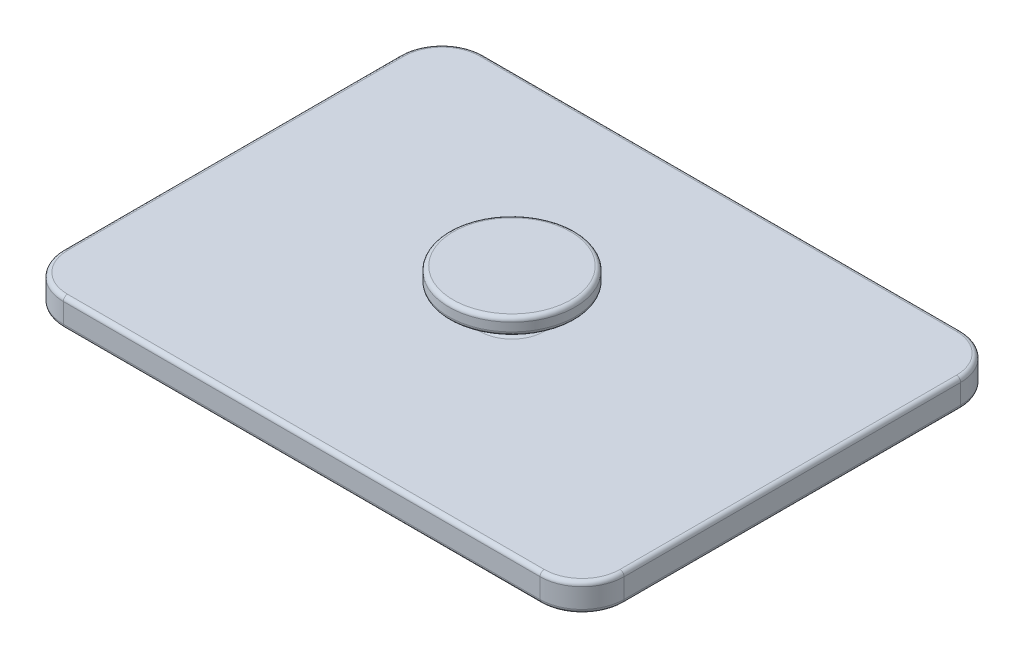
ISO-10303-21;
HEADER;
FILE_DESCRIPTION(('STEP AP214'),'2;1');
FILE_NAME('part.step','',(''),(''),'','','');
FILE_SCHEMA(('AUTOMOTIVE_DESIGN { 1 0 10303 214 1 1 1 1 }'));
ENDSEC;
DATA;
#1=APPLICATION_CONTEXT('core data for automotive mechanical design processes');
#2=APPLICATION_PROTOCOL_DEFINITION('international standard','automotive_design',2000,#1);
#3=PRODUCT_CONTEXT('',#1,'mechanical');
#4=PRODUCT('Part','Part','',(#3));
#5=PRODUCT_RELATED_PRODUCT_CATEGORY('part','',(#4));
#6=PRODUCT_DEFINITION_FORMATION('','',#4);
#7=PRODUCT_DEFINITION_CONTEXT('part definition',#1,'design');
#8=PRODUCT_DEFINITION('design','',#6,#7);
#9=PRODUCT_DEFINITION_SHAPE('','',#8);
#10=(LENGTH_UNIT() NAMED_UNIT(*) SI_UNIT(.MILLI.,.METRE.));
#11=(NAMED_UNIT(*) PLANE_ANGLE_UNIT() SI_UNIT($,.RADIAN.));
#12=(NAMED_UNIT(*) SI_UNIT($,.STERADIAN.) SOLID_ANGLE_UNIT());
#13=UNCERTAINTY_MEASURE_WITH_UNIT(LENGTH_MEASURE(1.E-05),#10,'distance_accuracy_value','');
#14=(GEOMETRIC_REPRESENTATION_CONTEXT(3) GLOBAL_UNCERTAINTY_ASSIGNED_CONTEXT((#13)) GLOBAL_UNIT_ASSIGNED_CONTEXT((#10,
#11,#12)) REPRESENTATION_CONTEXT('',''));
#15=CARTESIAN_POINT('',(0.,0.,0.));
#16=DIRECTION('',(0.,0.,1.));
#17=DIRECTION('',(1.,0.,0.));
#18=AXIS2_PLACEMENT_3D('',#15,#16,#17);
#19=CARTESIAN_POINT('',(0.,-21.2,0.));
#20=DIRECTION('',(0.,1.,0.));
#21=DIRECTION('',(0.,0.,1.));
#22=AXIS2_PLACEMENT_3D('',#19,#20,#21);
#23=CYLINDRICAL_SURFACE('',#22,4.5);
#24=CARTESIAN_POINT('',(0.,-20.3,0.));
#25=DIRECTION('',(0.,-1.,0.));
#26=DIRECTION('',(0.,0.,-1.));
#27=AXIS2_PLACEMENT_3D('',#24,#25,#26);
#28=CIRCLE('',#27,4.5);
#29=CARTESIAN_POINT('',(0.,-20.3,-4.5));
#30=VERTEX_POINT('',#29);
#31=EDGE_CURVE('E277',#30,#30,#28,.T.);
#32=ORIENTED_EDGE('',*,*,#31,.T.);
#33=EDGE_LOOP('',(#32));
#34=FACE_BOUND('',#33,.T.);
#35=CARTESIAN_POINT('',(0.,-20.9,0.));
#36=DIRECTION('',(0.,-1.,0.));
#37=DIRECTION('',(0.,0.,-1.));
#38=AXIS2_PLACEMENT_3D('',#35,#36,#37);
#39=CIRCLE('',#38,4.5);
#40=CARTESIAN_POINT('',(0.,-20.9,-4.5));
#41=VERTEX_POINT('',#40);
#42=EDGE_CURVE('E274',#41,#41,#39,.F.);
#43=ORIENTED_EDGE('',*,*,#42,.T.);
#44=EDGE_LOOP('',(#43));
#45=FACE_BOUND('',#44,.T.);
#46=ADVANCED_FACE('F34',(#34,#45),#23,.T.);
#47=CARTESIAN_POINT('',(0.,-21.2,0.));
#48=DIRECTION('',(0.,-1.,0.));
#49=DIRECTION('',(0.,0.,-1.));
#50=AXIS2_PLACEMENT_3D('',#47,#48,#49);
#51=PLANE('',#50);
#52=CARTESIAN_POINT('',(0.,-21.2,0.));
#53=DIRECTION('',(0.,-1.,0.));
#54=DIRECTION('',(0.,0.,-1.));
#55=AXIS2_PLACEMENT_3D('',#52,#53,#54);
#56=CIRCLE('',#55,2.3);
#57=CARTESIAN_POINT('',(0.,-21.2,-2.3));
#58=VERTEX_POINT('',#57);
#59=EDGE_CURVE('E11',#58,#58,#56,.F.);
#60=ORIENTED_EDGE('',*,*,#59,.T.);
#61=EDGE_LOOP('',(#60));
#62=FACE_BOUND('',#61,.T.);
#63=CARTESIAN_POINT('',(0.,-21.2,0.));
#64=DIRECTION('',(0.,-1.,0.));
#65=DIRECTION('',(0.,0.,-1.));
#66=AXIS2_PLACEMENT_3D('',#63,#64,#65);
#67=CIRCLE('',#66,4.2);
#68=CARTESIAN_POINT('',(0.,-21.2,-4.2));
#69=VERTEX_POINT('',#68);
#70=EDGE_CURVE('E250',#69,#69,#67,.T.);
#71=ORIENTED_EDGE('',*,*,#70,.T.);
#72=EDGE_LOOP('',(#71));
#73=FACE_BOUND('',#72,.T.);
#74=ADVANCED_FACE('F304',(#62,#73),#51,.T.);
#75=CARTESIAN_POINT('',(0.,-20.,0.));
#76=DIRECTION('',(0.,-1.,0.));
#77=DIRECTION('',(0.,0.,-1.));
#78=AXIS2_PLACEMENT_3D('',#75,#76,#77);
#79=PLANE('',#78);
#80=CARTESIAN_POINT('',(0.,-20.,0.));
#81=DIRECTION('',(0.,-1.,0.));
#82=DIRECTION('',(0.,0.,-1.));
#83=AXIS2_PLACEMENT_3D('',#80,#81,#82);
#84=CIRCLE('',#83,4.2);
#85=CARTESIAN_POINT('',(0.,-20.,-4.2));
#86=VERTEX_POINT('',#85);
#87=EDGE_CURVE('E280',#86,#86,#84,.F.);
#88=ORIENTED_EDGE('',*,*,#87,.T.);
#89=EDGE_LOOP('',(#88));
#90=FACE_BOUND('',#89,.T.);
#91=ADVANCED_FACE('F310',(#90),#79,.F.);
#92=CARTESIAN_POINT('',(0.,-22.9,0.));
#93=DIRECTION('',(0.,1.,0.));
#94=DIRECTION('',(0.,0.,1.));
#95=AXIS2_PLACEMENT_3D('',#92,#93,#94);
#96=CYLINDRICAL_SURFACE('',#95,2.);
#97=CARTESIAN_POINT('',(0.,-21.5,0.));
#98=DIRECTION('',(0.,-1.,0.));
#99=DIRECTION('',(0.,0.,-1.));
#100=AXIS2_PLACEMENT_3D('',#97,#98,#99);
#101=CIRCLE('',#100,2.);
#102=CARTESIAN_POINT('',(0.,-21.5,-2.));
#103=VERTEX_POINT('',#102);
#104=EDGE_CURVE('E42',#103,#103,#101,.T.);
#105=ORIENTED_EDGE('',*,*,#104,.T.);
#106=EDGE_LOOP('',(#105));
#107=FACE_BOUND('',#106,.T.);
#108=CARTESIAN_POINT('',(0.,-22.6,0.));
#109=DIRECTION('',(0.,-1.,0.));
#110=DIRECTION('',(0.,0.,-1.));
#111=AXIS2_PLACEMENT_3D('',#108,#109,#110);
#112=CIRCLE('',#111,2.);
#113=CARTESIAN_POINT('',(0.,-22.6,-2.));
#114=VERTEX_POINT('',#113);
#115=EDGE_CURVE('E286',#114,#114,#112,.F.);
#116=ORIENTED_EDGE('',*,*,#115,.T.);
#117=EDGE_LOOP('',(#116));
#118=FACE_BOUND('',#117,.T.);
#119=ADVANCED_FACE('F291',(#107,#118),#96,.T.);
#120=CARTESIAN_POINT('',(-20.,-24.9,-15.));
#121=DIRECTION('',(1.,0.,0.));
#122=DIRECTION('',(0.,0.,-1.));
#123=AXIS2_PLACEMENT_3D('',#120,#121,#122);
#124=PLANE('',#123);
#125=DIRECTION('',(0.,1.,0.));
#126=VECTOR('',#125,1.);
#127=CARTESIAN_POINT('',(-20.,-24.9,12.));
#128=LINE('',#127,#126);
#129=CARTESIAN_POINT('',(-20.,-24.6,12.));
#130=VERTEX_POINT('',#129);
#131=CARTESIAN_POINT('',(-20.,-23.2,12.));
#132=VERTEX_POINT('',#131);
#133=EDGE_CURVE('E171',#130,#132,#128,.T.);
#134=ORIENTED_EDGE('',*,*,#133,.T.);
#135=DIRECTION('',(0.,0.,-1.));
#136=VECTOR('',#135,1.);
#137=CARTESIAN_POINT('',(-20.,-23.2,-15.));
#138=LINE('',#137,#136);
#139=CARTESIAN_POINT('',(-20.,-23.2,-12.));
#140=VERTEX_POINT('',#139);
#141=EDGE_CURVE('E238',#132,#140,#138,.T.);
#142=ORIENTED_EDGE('',*,*,#141,.T.);
#143=DIRECTION('',(0.,1.,0.));
#144=VECTOR('',#143,1.);
#145=CARTESIAN_POINT('',(-20.,-24.9,-12.));
#146=LINE('',#145,#144);
#147=CARTESIAN_POINT('',(-20.,-24.6,-12.));
#148=VERTEX_POINT('',#147);
#149=EDGE_CURVE('E666',#140,#148,#146,.F.);
#150=ORIENTED_EDGE('',*,*,#149,.T.);
#151=DIRECTION('',(0.,0.,-1.));
#152=VECTOR('',#151,1.);
#153=CARTESIAN_POINT('',(-20.,-24.6,12.));
#154=LINE('',#153,#152);
#155=EDGE_CURVE('E178',#148,#130,#154,.F.);
#156=ORIENTED_EDGE('',*,*,#155,.T.);
#157=EDGE_LOOP('',(#134,#142,#150,#156));
#158=FACE_BOUND('',#157,.T.);
#159=ADVANCED_FACE('F408',(#158),#124,.F.);
#160=CARTESIAN_POINT('',(20.,-24.9,-15.));
#161=DIRECTION('',(0.,0.,1.));
#162=DIRECTION('',(1.,0.,0.));
#163=AXIS2_PLACEMENT_3D('',#160,#161,#162);
#164=PLANE('',#163);
#165=DIRECTION('',(0.,1.,0.));
#166=VECTOR('',#165,1.);
#167=CARTESIAN_POINT('',(-17.,-24.9,-15.));
#168=LINE('',#167,#166);
#169=CARTESIAN_POINT('',(-17.,-24.6,-15.));
#170=VERTEX_POINT('',#169);
#171=CARTESIAN_POINT('',(-17.,-23.2,-15.));
#172=VERTEX_POINT('',#171);
#173=EDGE_CURVE('E656',#170,#172,#168,.T.);
#174=ORIENTED_EDGE('',*,*,#173,.T.);
#175=DIRECTION('',(1.,0.,0.));
#176=VECTOR('',#175,1.);
#177=CARTESIAN_POINT('',(20.,-23.2,-15.));
#178=LINE('',#177,#176);
#179=CARTESIAN_POINT('',(17.,-23.2,-15.));
#180=VERTEX_POINT('',#179);
#181=EDGE_CURVE('E49',#172,#180,#178,.T.);
#182=ORIENTED_EDGE('',*,*,#181,.T.);
#183=DIRECTION('',(0.,1.,0.));
#184=VECTOR('',#183,1.);
#185=CARTESIAN_POINT('',(17.,-24.9,-15.));
#186=LINE('',#185,#184);
#187=CARTESIAN_POINT('',(17.,-24.6,-15.));
#188=VERTEX_POINT('',#187);
#189=EDGE_CURVE('E660',#180,#188,#186,.F.);
#190=ORIENTED_EDGE('',*,*,#189,.T.);
#191=DIRECTION('',(1.,0.,0.));
#192=VECTOR('',#191,1.);
#193=CARTESIAN_POINT('',(-17.,-24.6,-15.));
#194=LINE('',#193,#192);
#195=EDGE_CURVE('E198',#188,#170,#194,.F.);
#196=ORIENTED_EDGE('',*,*,#195,.T.);
#197=EDGE_LOOP('',(#174,#182,#190,#196));
#198=FACE_BOUND('',#197,.T.);
#199=ADVANCED_FACE('F413',(#198),#164,.F.);
#200=CARTESIAN_POINT('',(20.,-24.9,-15.));
#201=DIRECTION('',(-1.,0.,0.));
#202=DIRECTION('',(0.,0.,1.));
#203=AXIS2_PLACEMENT_3D('',#200,#201,#202);
#204=PLANE('',#203);
#205=DIRECTION('',(0.,1.,0.));
#206=VECTOR('',#205,1.);
#207=CARTESIAN_POINT('',(20.,-24.9,-12.));
#208=LINE('',#207,#206);
#209=CARTESIAN_POINT('',(20.,-24.6,-12.));
#210=VERTEX_POINT('',#209);
#211=CARTESIAN_POINT('',(20.,-23.2,-12.));
#212=VERTEX_POINT('',#211);
#213=EDGE_CURVE('E650',#210,#212,#208,.T.);
#214=ORIENTED_EDGE('',*,*,#213,.T.);
#215=DIRECTION('',(0.,0.,1.));
#216=VECTOR('',#215,1.);
#217=CARTESIAN_POINT('',(20.,-23.2,-15.));
#218=LINE('',#217,#216);
#219=CARTESIAN_POINT('',(20.,-23.2,12.));
#220=VERTEX_POINT('',#219);
#221=EDGE_CURVE('E246',#212,#220,#218,.T.);
#222=ORIENTED_EDGE('',*,*,#221,.T.);
#223=DIRECTION('',(0.,1.,0.));
#224=VECTOR('',#223,1.);
#225=CARTESIAN_POINT('',(20.,-24.9,12.));
#226=LINE('',#225,#224);
#227=CARTESIAN_POINT('',(20.,-24.6,12.));
#228=VERTEX_POINT('',#227);
#229=EDGE_CURVE('E218',#220,#228,#226,.F.);
#230=ORIENTED_EDGE('',*,*,#229,.T.);
#231=DIRECTION('',(0.,0.,1.));
#232=VECTOR('',#231,1.);
#233=CARTESIAN_POINT('',(20.,-24.6,-12.));
#234=LINE('',#233,#232);
#235=EDGE_CURVE('E193',#228,#210,#234,.F.);
#236=ORIENTED_EDGE('',*,*,#235,.T.);
#237=EDGE_LOOP('',(#214,#222,#230,#236));
#238=FACE_BOUND('',#237,.T.);
#239=ADVANCED_FACE('F419',(#238),#204,.F.);
#240=CARTESIAN_POINT('',(20.,-24.9,15.));
#241=DIRECTION('',(0.,0.,-1.));
#242=DIRECTION('',(-1.,0.,0.));
#243=AXIS2_PLACEMENT_3D('',#240,#241,#242);
#244=PLANE('',#243);
#245=DIRECTION('',(0.,1.,0.));
#246=VECTOR('',#245,1.);
#247=CARTESIAN_POINT('',(17.,-24.9,15.));
#248=LINE('',#247,#246);
#249=CARTESIAN_POINT('',(17.,-24.6,15.));
#250=VERTEX_POINT('',#249);
#251=CARTESIAN_POINT('',(17.,-23.2,15.));
#252=VERTEX_POINT('',#251);
#253=EDGE_CURVE('E664',#250,#252,#248,.T.);
#254=ORIENTED_EDGE('',*,*,#253,.T.);
#255=DIRECTION('',(-1.,0.,0.));
#256=VECTOR('',#255,1.);
#257=CARTESIAN_POINT('',(20.,-23.2,15.));
#258=LINE('',#257,#256);
#259=CARTESIAN_POINT('',(-17.,-23.2,15.));
#260=VERTEX_POINT('',#259);
#261=EDGE_CURVE('E242',#252,#260,#258,.T.);
#262=ORIENTED_EDGE('',*,*,#261,.T.);
#263=DIRECTION('',(0.,1.,0.));
#264=VECTOR('',#263,1.);
#265=CARTESIAN_POINT('',(-17.,-24.9,15.));
#266=LINE('',#265,#264);
#267=CARTESIAN_POINT('',(-17.,-24.6,15.));
#268=VERTEX_POINT('',#267);
#269=EDGE_CURVE('E662',#260,#268,#266,.F.);
#270=ORIENTED_EDGE('',*,*,#269,.T.);
#271=DIRECTION('',(-1.,0.,0.));
#272=VECTOR('',#271,1.);
#273=CARTESIAN_POINT('',(17.,-24.6,15.));
#274=LINE('',#273,#272);
#275=EDGE_CURVE('E188',#268,#250,#274,.F.);
#276=ORIENTED_EDGE('',*,*,#275,.T.);
#277=EDGE_LOOP('',(#254,#262,#270,#276));
#278=FACE_BOUND('',#277,.T.);
#279=ADVANCED_FACE('F422',(#278),#244,.F.);
#280=CARTESIAN_POINT('',(0.,-24.9,0.));
#281=DIRECTION('',(0.,-1.,0.));
#282=DIRECTION('',(0.,0.,-1.));
#283=AXIS2_PLACEMENT_3D('',#280,#281,#282);
#284=PLANE('',#283);
#285=DIRECTION('',(0.,0.,-1.));
#286=VECTOR('',#285,1.);
#287=CARTESIAN_POINT('',(-19.7,-24.9,-12.));
#288=LINE('',#287,#286);
#289=CARTESIAN_POINT('',(-19.7,-24.9,12.));
#290=VERTEX_POINT('',#289);
#291=CARTESIAN_POINT('',(-19.7,-24.9,-12.));
#292=VERTEX_POINT('',#291);
#293=EDGE_CURVE('E175',#290,#292,#288,.T.);
#294=ORIENTED_EDGE('',*,*,#293,.T.);
#295=CARTESIAN_POINT('',(-17.,-24.9,-12.));
#296=DIRECTION('',(0.,-1.,0.));
#297=DIRECTION('',(0.,0.,-1.));
#298=AXIS2_PLACEMENT_3D('',#295,#296,#297);
#299=CIRCLE('',#298,2.7);
#300=CARTESIAN_POINT('',(-17.,-24.9,-14.7));
#301=VERTEX_POINT('',#300);
#302=EDGE_CURVE('E155',#292,#301,#299,.T.);
#303=ORIENTED_EDGE('',*,*,#302,.T.);
#304=DIRECTION('',(1.,0.,0.));
#305=VECTOR('',#304,1.);
#306=CARTESIAN_POINT('',(17.,-24.9,-14.7));
#307=LINE('',#306,#305);
#308=CARTESIAN_POINT('',(17.,-24.9,-14.7));
#309=VERTEX_POINT('',#308);
#310=EDGE_CURVE('E164',#301,#309,#307,.T.);
#311=ORIENTED_EDGE('',*,*,#310,.T.);
#312=CARTESIAN_POINT('',(17.,-24.9,-12.));
#313=DIRECTION('',(0.,-1.,0.));
#314=DIRECTION('',(0.,0.,-1.));
#315=AXIS2_PLACEMENT_3D('',#312,#313,#314);
#316=CIRCLE('',#315,2.7);
#317=CARTESIAN_POINT('',(19.7,-24.9,-12.));
#318=VERTEX_POINT('',#317);
#319=EDGE_CURVE('E170',#309,#318,#316,.T.);
#320=ORIENTED_EDGE('',*,*,#319,.T.);
#321=DIRECTION('',(0.,0.,1.));
#322=VECTOR('',#321,1.);
#323=CARTESIAN_POINT('',(19.7,-24.9,12.));
#324=LINE('',#323,#322);
#325=CARTESIAN_POINT('',(19.7,-24.9,12.));
#326=VERTEX_POINT('',#325);
#327=EDGE_CURVE('E671',#318,#326,#324,.T.);
#328=ORIENTED_EDGE('',*,*,#327,.T.);
#329=CARTESIAN_POINT('',(17.,-24.9,12.));
#330=DIRECTION('',(0.,-1.,0.));
#331=DIRECTION('',(0.,0.,-1.));
#332=AXIS2_PLACEMENT_3D('',#329,#330,#331);
#333=CIRCLE('',#332,2.7);
#334=CARTESIAN_POINT('',(17.,-24.9,14.7));
#335=VERTEX_POINT('',#334);
#336=EDGE_CURVE('E673',#326,#335,#333,.T.);
#337=ORIENTED_EDGE('',*,*,#336,.T.);
#338=DIRECTION('',(-1.,0.,0.));
#339=VECTOR('',#338,1.);
#340=CARTESIAN_POINT('',(-17.,-24.9,14.7));
#341=LINE('',#340,#339);
#342=CARTESIAN_POINT('',(-17.,-24.9,14.7));
#343=VERTEX_POINT('',#342);
#344=EDGE_CURVE('E675',#335,#343,#341,.T.);
#345=ORIENTED_EDGE('',*,*,#344,.T.);
#346=CARTESIAN_POINT('',(-17.,-24.9,12.));
#347=DIRECTION('',(0.,-1.,0.));
#348=DIRECTION('',(0.,0.,-1.));
#349=AXIS2_PLACEMENT_3D('',#346,#347,#348);
#350=CIRCLE('',#349,2.7);
#351=EDGE_CURVE('E180',#343,#290,#350,.T.);
#352=ORIENTED_EDGE('',*,*,#351,.T.);
#353=EDGE_LOOP('',(#294,#303,#311,#320,#328,#337,#345,#352));
#354=FACE_BOUND('',#353,.T.);
#355=ADVANCED_FACE('F173',(#354),#284,.T.);
#356=CARTESIAN_POINT('',(0.,-22.9,0.));
#357=DIRECTION('',(0.,-1.,0.));
#358=DIRECTION('',(0.,0.,-1.));
#359=AXIS2_PLACEMENT_3D('',#356,#357,#358);
#360=PLANE('',#359);
#361=CARTESIAN_POINT('',(0.,-22.9,0.));
#362=DIRECTION('',(0.,-1.,0.));
#363=DIRECTION('',(0.,0.,-1.));
#364=AXIS2_PLACEMENT_3D('',#361,#362,#363);
#365=CIRCLE('',#364,2.3);
#366=CARTESIAN_POINT('',(0.,-22.9,-2.3));
#367=VERTEX_POINT('',#366);
#368=EDGE_CURVE('E283',#367,#367,#365,.T.);
#369=ORIENTED_EDGE('',*,*,#368,.T.);
#370=EDGE_LOOP('',(#369));
#371=FACE_BOUND('',#370,.T.);
#372=DIRECTION('',(1.,0.,0.));
#373=VECTOR('',#372,1.);
#374=CARTESIAN_POINT('',(0.,-22.9,-14.7));
#375=LINE('',#374,#373);
#376=CARTESIAN_POINT('',(17.,-22.9,-14.7));
#377=VERTEX_POINT('',#376);
#378=CARTESIAN_POINT('',(-17.,-22.9,-14.7));
#379=VERTEX_POINT('',#378);
#380=EDGE_CURVE('E199',#377,#379,#375,.F.);
#381=ORIENTED_EDGE('',*,*,#380,.T.);
#382=CARTESIAN_POINT('',(-17.,-22.9,-12.));
#383=DIRECTION('',(0.,-1.,0.));
#384=DIRECTION('',(0.,0.,-1.));
#385=AXIS2_PLACEMENT_3D('',#382,#383,#384);
#386=CIRCLE('',#385,2.7);
#387=CARTESIAN_POINT('',(-19.7,-22.9,-12.));
#388=VERTEX_POINT('',#387);
#389=EDGE_CURVE('E232',#379,#388,#386,.F.);
#390=ORIENTED_EDGE('',*,*,#389,.T.);
#391=DIRECTION('',(0.,0.,-1.));
#392=VECTOR('',#391,1.);
#393=CARTESIAN_POINT('',(-19.7,-22.9,0.));
#394=LINE('',#393,#392);
#395=CARTESIAN_POINT('',(-19.7,-22.9,12.));
#396=VERTEX_POINT('',#395);
#397=EDGE_CURVE('E230',#388,#396,#394,.F.);
#398=ORIENTED_EDGE('',*,*,#397,.T.);
#399=CARTESIAN_POINT('',(-17.,-22.9,12.));
#400=DIRECTION('',(0.,-1.,0.));
#401=DIRECTION('',(0.,0.,-1.));
#402=AXIS2_PLACEMENT_3D('',#399,#400,#401);
#403=CIRCLE('',#402,2.7);
#404=CARTESIAN_POINT('',(-17.,-22.9,14.7));
#405=VERTEX_POINT('',#404);
#406=EDGE_CURVE('E228',#396,#405,#403,.F.);
#407=ORIENTED_EDGE('',*,*,#406,.T.);
#408=DIRECTION('',(-1.,0.,0.));
#409=VECTOR('',#408,1.);
#410=CARTESIAN_POINT('',(0.,-22.9,14.7));
#411=LINE('',#410,#409);
#412=CARTESIAN_POINT('',(17.,-22.9,14.7));
#413=VERTEX_POINT('',#412);
#414=EDGE_CURVE('E226',#405,#413,#411,.F.);
#415=ORIENTED_EDGE('',*,*,#414,.T.);
#416=CARTESIAN_POINT('',(17.,-22.9,12.));
#417=DIRECTION('',(0.,-1.,0.));
#418=DIRECTION('',(0.,0.,-1.));
#419=AXIS2_PLACEMENT_3D('',#416,#417,#418);
#420=CIRCLE('',#419,2.7);
#421=CARTESIAN_POINT('',(19.7,-22.9,12.));
#422=VERTEX_POINT('',#421);
#423=EDGE_CURVE('E224',#413,#422,#420,.F.);
#424=ORIENTED_EDGE('',*,*,#423,.T.);
#425=DIRECTION('',(0.,0.,1.));
#426=VECTOR('',#425,1.);
#427=CARTESIAN_POINT('',(19.7,-22.9,0.));
#428=LINE('',#427,#426);
#429=CARTESIAN_POINT('',(19.7,-22.9,-12.));
#430=VERTEX_POINT('',#429);
#431=EDGE_CURVE('E222',#422,#430,#428,.F.);
#432=ORIENTED_EDGE('',*,*,#431,.T.);
#433=CARTESIAN_POINT('',(17.,-22.9,-12.));
#434=DIRECTION('',(0.,-1.,0.));
#435=DIRECTION('',(0.,0.,-1.));
#436=AXIS2_PLACEMENT_3D('',#433,#434,#435);
#437=CIRCLE('',#436,2.7);
#438=EDGE_CURVE('E220',#430,#377,#437,.F.);
#439=ORIENTED_EDGE('',*,*,#438,.T.);
#440=EDGE_LOOP('',(#381,#390,#398,#407,#415,#424,#432,#439));
#441=FACE_BOUND('',#440,.T.);
#442=ADVANCED_FACE('F320',(#371,#441),#360,.F.);
#443=CARTESIAN_POINT('',(17.,-24.9,-12.));
#444=DIRECTION('',(0.,1.,0.));
#445=DIRECTION('',(0.,0.,1.));
#446=AXIS2_PLACEMENT_3D('',#443,#444,#445);
#447=CYLINDRICAL_SURFACE('',#446,3.);
#448=ORIENTED_EDGE('',*,*,#189,.F.);
#449=CARTESIAN_POINT('',(17.,-23.2,-12.));
#450=DIRECTION('',(0.,-1.,0.));
#451=DIRECTION('',(0.,0.,-1.));
#452=AXIS2_PLACEMENT_3D('',#449,#450,#451);
#453=CIRCLE('',#452,3.);
#454=EDGE_CURVE('E56',#180,#212,#453,.T.);
#455=ORIENTED_EDGE('',*,*,#454,.T.);
#456=ORIENTED_EDGE('',*,*,#213,.F.);
#457=CARTESIAN_POINT('',(17.,-24.6,-12.));
#458=DIRECTION('',(0.,-1.,0.));
#459=DIRECTION('',(0.,0.,-1.));
#460=AXIS2_PLACEMENT_3D('',#457,#458,#459);
#461=CIRCLE('',#460,3.);
#462=EDGE_CURVE('E195',#210,#188,#461,.F.);
#463=ORIENTED_EDGE('',*,*,#462,.T.);
#464=EDGE_LOOP('',(#448,#455,#456,#463));
#465=FACE_BOUND('',#464,.T.);
#466=ADVANCED_FACE('F316',(#465),#447,.T.);
#467=CARTESIAN_POINT('',(17.,-24.9,12.));
#468=DIRECTION('',(0.,1.,0.));
#469=DIRECTION('',(0.,0.,1.));
#470=AXIS2_PLACEMENT_3D('',#467,#468,#469);
#471=CYLINDRICAL_SURFACE('',#470,3.);
#472=ORIENTED_EDGE('',*,*,#229,.F.);
#473=CARTESIAN_POINT('',(17.,-23.2,12.));
#474=DIRECTION('',(0.,-1.,0.));
#475=DIRECTION('',(0.,0.,-1.));
#476=AXIS2_PLACEMENT_3D('',#473,#474,#475);
#477=CIRCLE('',#476,3.);
#478=EDGE_CURVE('E244',#220,#252,#477,.T.);
#479=ORIENTED_EDGE('',*,*,#478,.T.);
#480=ORIENTED_EDGE('',*,*,#253,.F.);
#481=CARTESIAN_POINT('',(17.,-24.6,12.));
#482=DIRECTION('',(0.,-1.,0.));
#483=DIRECTION('',(0.,0.,-1.));
#484=AXIS2_PLACEMENT_3D('',#481,#482,#483);
#485=CIRCLE('',#484,3.);
#486=EDGE_CURVE('E190',#250,#228,#485,.F.);
#487=ORIENTED_EDGE('',*,*,#486,.T.);
#488=EDGE_LOOP('',(#472,#479,#480,#487));
#489=FACE_BOUND('',#488,.T.);
#490=ADVANCED_FACE('F319',(#489),#471,.T.);
#491=CARTESIAN_POINT('',(-17.,-24.9,12.));
#492=DIRECTION('',(0.,1.,0.));
#493=DIRECTION('',(0.,0.,1.));
#494=AXIS2_PLACEMENT_3D('',#491,#492,#493);
#495=CYLINDRICAL_SURFACE('',#494,3.);
#496=ORIENTED_EDGE('',*,*,#269,.F.);
#497=CARTESIAN_POINT('',(-17.,-23.2,12.));
#498=DIRECTION('',(0.,-1.,0.));
#499=DIRECTION('',(0.,0.,-1.));
#500=AXIS2_PLACEMENT_3D('',#497,#498,#499);
#501=CIRCLE('',#500,3.);
#502=EDGE_CURVE('E240',#260,#132,#501,.T.);
#503=ORIENTED_EDGE('',*,*,#502,.T.);
#504=ORIENTED_EDGE('',*,*,#133,.F.);
#505=CARTESIAN_POINT('',(-17.,-24.6,12.));
#506=DIRECTION('',(0.,-1.,0.));
#507=DIRECTION('',(0.,0.,-1.));
#508=AXIS2_PLACEMENT_3D('',#505,#506,#507);
#509=CIRCLE('',#508,3.);
#510=EDGE_CURVE('E185',#130,#268,#509,.F.);
#511=ORIENTED_EDGE('',*,*,#510,.T.);
#512=EDGE_LOOP('',(#496,#503,#504,#511));
#513=FACE_BOUND('',#512,.T.);
#514=ADVANCED_FACE('F323',(#513),#495,.T.);
#515=CARTESIAN_POINT('',(-17.,-24.9,-12.));
#516=DIRECTION('',(0.,1.,0.));
#517=DIRECTION('',(0.,0.,1.));
#518=AXIS2_PLACEMENT_3D('',#515,#516,#517);
#519=CYLINDRICAL_SURFACE('',#518,3.);
#520=ORIENTED_EDGE('',*,*,#149,.F.);
#521=CARTESIAN_POINT('',(-17.,-23.2,-12.));
#522=DIRECTION('',(0.,-1.,0.));
#523=DIRECTION('',(0.,0.,-1.));
#524=AXIS2_PLACEMENT_3D('',#521,#522,#523);
#525=CIRCLE('',#524,3.);
#526=EDGE_CURVE('E235',#140,#172,#525,.T.);
#527=ORIENTED_EDGE('',*,*,#526,.T.);
#528=ORIENTED_EDGE('',*,*,#173,.F.);
#529=CARTESIAN_POINT('',(-17.,-24.6,-12.));
#530=DIRECTION('',(0.,-1.,0.));
#531=DIRECTION('',(0.,0.,-1.));
#532=AXIS2_PLACEMENT_3D('',#529,#530,#531);
#533=CIRCLE('',#532,3.);
#534=EDGE_CURVE('E157',#170,#148,#533,.F.);
#535=ORIENTED_EDGE('',*,*,#534,.T.);
#536=EDGE_LOOP('',(#520,#527,#528,#535));
#537=FACE_BOUND('',#536,.T.);
#538=ADVANCED_FACE('F327',(#537),#519,.T.);
#539=CARTESIAN_POINT('',(17.,-24.6,12.));
#540=DIRECTION('',(0.,-1.,0.));
#541=DIRECTION('',(0.,0.,-1.));
#542=AXIS2_PLACEMENT_3D('',#539,#540,#541);
#543=TOROIDAL_SURFACE('',#542,2.7,0.3);
#544=CARTESIAN_POINT('',(19.7,-24.6,12.));
#545=DIRECTION('',(0.,0.,-1.));
#546=DIRECTION('',(-1.,0.,0.));
#547=AXIS2_PLACEMENT_3D('',#544,#545,#546);
#548=CIRCLE('',#547,0.3);
#549=EDGE_CURVE('E212',#228,#326,#548,.T.);
#550=ORIENTED_EDGE('',*,*,#549,.F.);
#551=ORIENTED_EDGE('',*,*,#486,.F.);
#552=CARTESIAN_POINT('',(17.,-24.6,14.7));
#553=DIRECTION('',(-1.,0.,0.));
#554=DIRECTION('',(0.,0.,1.));
#555=AXIS2_PLACEMENT_3D('',#552,#553,#554);
#556=CIRCLE('',#555,0.3);
#557=EDGE_CURVE('E215',#335,#250,#556,.T.);
#558=ORIENTED_EDGE('',*,*,#557,.F.);
#559=ORIENTED_EDGE('',*,*,#336,.F.);
#560=EDGE_LOOP('',(#550,#551,#558,#559));
#561=FACE_BOUND('',#560,.T.);
#562=ADVANCED_FACE('F331',(#561),#543,.T.);
#563=CARTESIAN_POINT('',(0.,-24.6,14.7));
#564=DIRECTION('',(1.,0.,0.));
#565=DIRECTION('',(0.,0.,-1.));
#566=AXIS2_PLACEMENT_3D('',#563,#564,#565);
#567=CYLINDRICAL_SURFACE('',#566,0.3);
#568=ORIENTED_EDGE('',*,*,#557,.T.);
#569=ORIENTED_EDGE('',*,*,#275,.F.);
#570=CARTESIAN_POINT('',(-17.,-24.6,14.7));
#571=DIRECTION('',(-1.,0.,0.));
#572=DIRECTION('',(0.,0.,1.));
#573=AXIS2_PLACEMENT_3D('',#570,#571,#572);
#574=CIRCLE('',#573,0.3);
#575=EDGE_CURVE('E209',#343,#268,#574,.T.);
#576=ORIENTED_EDGE('',*,*,#575,.F.);
#577=ORIENTED_EDGE('',*,*,#344,.F.);
#578=EDGE_LOOP('',(#568,#569,#576,#577));
#579=FACE_BOUND('',#578,.T.);
#580=ADVANCED_FACE('F353',(#579),#567,.T.);
#581=CARTESIAN_POINT('',(19.7,-24.6,0.));
#582=DIRECTION('',(0.,0.,-1.));
#583=DIRECTION('',(-1.,0.,0.));
#584=AXIS2_PLACEMENT_3D('',#581,#582,#583);
#585=CYLINDRICAL_SURFACE('',#584,0.3);
#586=ORIENTED_EDGE('',*,*,#549,.T.);
#587=ORIENTED_EDGE('',*,*,#327,.F.);
#588=CARTESIAN_POINT('',(19.7,-24.6,-12.));
#589=DIRECTION('',(0.,0.,-1.));
#590=DIRECTION('',(-1.,0.,0.));
#591=AXIS2_PLACEMENT_3D('',#588,#589,#590);
#592=CIRCLE('',#591,0.3);
#593=EDGE_CURVE('E206',#210,#318,#592,.T.);
#594=ORIENTED_EDGE('',*,*,#593,.F.);
#595=ORIENTED_EDGE('',*,*,#235,.F.);
#596=EDGE_LOOP('',(#586,#587,#594,#595));
#597=FACE_BOUND('',#596,.T.);
#598=ADVANCED_FACE('F349',(#597),#585,.T.);
#599=CARTESIAN_POINT('',(-17.,-24.6,12.));
#600=DIRECTION('',(0.,-1.,0.));
#601=DIRECTION('',(0.,0.,-1.));
#602=AXIS2_PLACEMENT_3D('',#599,#600,#601);
#603=TOROIDAL_SURFACE('',#602,2.7,0.3);
#604=ORIENTED_EDGE('',*,*,#575,.T.);
#605=ORIENTED_EDGE('',*,*,#510,.F.);
#606=CARTESIAN_POINT('',(-19.7,-24.6,12.));
#607=DIRECTION('',(0.,0.,-1.));
#608=DIRECTION('',(-1.,0.,0.));
#609=AXIS2_PLACEMENT_3D('',#606,#607,#608);
#610=CIRCLE('',#609,0.3);
#611=EDGE_CURVE('E203',#290,#130,#610,.T.);
#612=ORIENTED_EDGE('',*,*,#611,.F.);
#613=ORIENTED_EDGE('',*,*,#351,.F.);
#614=EDGE_LOOP('',(#604,#605,#612,#613));
#615=FACE_BOUND('',#614,.T.);
#616=ADVANCED_FACE('F345',(#615),#603,.T.);
#617=CARTESIAN_POINT('',(17.,-24.6,-12.));
#618=DIRECTION('',(0.,-1.,0.));
#619=DIRECTION('',(0.,0.,-1.));
#620=AXIS2_PLACEMENT_3D('',#617,#618,#619);
#621=TOROIDAL_SURFACE('',#620,2.7,0.3);
#622=ORIENTED_EDGE('',*,*,#593,.T.);
#623=ORIENTED_EDGE('',*,*,#319,.F.);
#624=CARTESIAN_POINT('',(17.,-24.6,-14.7));
#625=DIRECTION('',(-1.,0.,0.));
#626=DIRECTION('',(0.,0.,1.));
#627=AXIS2_PLACEMENT_3D('',#624,#625,#626);
#628=CIRCLE('',#627,0.3);
#629=EDGE_CURVE('E167',#188,#309,#628,.T.);
#630=ORIENTED_EDGE('',*,*,#629,.F.);
#631=ORIENTED_EDGE('',*,*,#462,.F.);
#632=EDGE_LOOP('',(#622,#623,#630,#631));
#633=FACE_BOUND('',#632,.T.);
#634=ADVANCED_FACE('F341',(#633),#621,.T.);
#635=CARTESIAN_POINT('',(-19.7,-24.6,0.));
#636=DIRECTION('',(0.,0.,1.));
#637=DIRECTION('',(1.,0.,0.));
#638=AXIS2_PLACEMENT_3D('',#635,#636,#637);
#639=CYLINDRICAL_SURFACE('',#638,0.3);
#640=ORIENTED_EDGE('',*,*,#611,.T.);
#641=ORIENTED_EDGE('',*,*,#155,.F.);
#642=CARTESIAN_POINT('',(-19.7,-24.6,-12.));
#643=DIRECTION('',(0.,0.,-1.));
#644=DIRECTION('',(-1.,0.,0.));
#645=AXIS2_PLACEMENT_3D('',#642,#643,#644);
#646=CIRCLE('',#645,0.3);
#647=EDGE_CURVE('E160',#292,#148,#646,.T.);
#648=ORIENTED_EDGE('',*,*,#647,.F.);
#649=ORIENTED_EDGE('',*,*,#293,.F.);
#650=EDGE_LOOP('',(#640,#641,#648,#649));
#651=FACE_BOUND('',#650,.T.);
#652=ADVANCED_FACE('F338',(#651),#639,.T.);
#653=CARTESIAN_POINT('',(0.,-24.6,-14.7));
#654=DIRECTION('',(-1.,0.,0.));
#655=DIRECTION('',(0.,0.,1.));
#656=AXIS2_PLACEMENT_3D('',#653,#654,#655);
#657=CYLINDRICAL_SURFACE('',#656,0.3);
#658=ORIENTED_EDGE('',*,*,#629,.T.);
#659=ORIENTED_EDGE('',*,*,#310,.F.);
#660=CARTESIAN_POINT('',(-17.,-24.6,-14.7));
#661=DIRECTION('',(-1.,0.,0.));
#662=DIRECTION('',(0.,0.,1.));
#663=AXIS2_PLACEMENT_3D('',#660,#661,#662);
#664=CIRCLE('',#663,0.3);
#665=EDGE_CURVE('E150',#170,#301,#664,.T.);
#666=ORIENTED_EDGE('',*,*,#665,.F.);
#667=ORIENTED_EDGE('',*,*,#195,.F.);
#668=EDGE_LOOP('',(#658,#659,#666,#667));
#669=FACE_BOUND('',#668,.T.);
#670=ADVANCED_FACE('F165',(#669),#657,.T.);
#671=CARTESIAN_POINT('',(-17.,-24.6,-12.));
#672=DIRECTION('',(0.,-1.,0.));
#673=DIRECTION('',(0.,0.,-1.));
#674=AXIS2_PLACEMENT_3D('',#671,#672,#673);
#675=TOROIDAL_SURFACE('',#674,2.7,0.3);
#676=ORIENTED_EDGE('',*,*,#647,.T.);
#677=ORIENTED_EDGE('',*,*,#534,.F.);
#678=ORIENTED_EDGE('',*,*,#665,.T.);
#679=ORIENTED_EDGE('',*,*,#302,.F.);
#680=EDGE_LOOP('',(#676,#677,#678,#679));
#681=FACE_BOUND('',#680,.T.);
#682=ADVANCED_FACE('F153',(#681),#675,.T.);
#683=CARTESIAN_POINT('',(17.,-23.2,12.));
#684=DIRECTION('',(0.,-1.,0.));
#685=DIRECTION('',(0.,0.,-1.));
#686=AXIS2_PLACEMENT_3D('',#683,#684,#685);
#687=TOROIDAL_SURFACE('',#686,2.7,0.3);
#688=CARTESIAN_POINT('',(17.,-23.2,14.7));
#689=DIRECTION('',(-1.,0.,0.));
#690=DIRECTION('',(0.,0.,1.));
#691=AXIS2_PLACEMENT_3D('',#688,#689,#690);
#692=CIRCLE('',#691,0.3);
#693=EDGE_CURVE('E267',#252,#413,#692,.T.);
#694=ORIENTED_EDGE('',*,*,#693,.F.);
#695=ORIENTED_EDGE('',*,*,#478,.F.);
#696=CARTESIAN_POINT('',(19.7,-23.2,12.));
#697=DIRECTION('',(0.,0.,-1.));
#698=DIRECTION('',(-1.,0.,0.));
#699=AXIS2_PLACEMENT_3D('',#696,#697,#698);
#700=CIRCLE('',#699,0.3);
#701=EDGE_CURVE('E161',#422,#220,#700,.T.);
#702=ORIENTED_EDGE('',*,*,#701,.F.);
#703=ORIENTED_EDGE('',*,*,#423,.F.);
#704=EDGE_LOOP('',(#694,#695,#702,#703));
#705=FACE_BOUND('',#704,.T.);
#706=ADVANCED_FACE('F335',(#705),#687,.T.);
#707=CARTESIAN_POINT('',(19.7,-23.2,-15.));
#708=DIRECTION('',(0.,0.,1.));
#709=DIRECTION('',(1.,0.,0.));
#710=AXIS2_PLACEMENT_3D('',#707,#708,#709);
#711=CYLINDRICAL_SURFACE('',#710,0.3);
#712=ORIENTED_EDGE('',*,*,#701,.T.);
#713=ORIENTED_EDGE('',*,*,#221,.F.);
#714=CARTESIAN_POINT('',(19.7,-23.2,-12.));
#715=DIRECTION('',(0.,0.,-1.));
#716=DIRECTION('',(-1.,0.,0.));
#717=AXIS2_PLACEMENT_3D('',#714,#715,#716);
#718=CIRCLE('',#717,0.3);
#719=EDGE_CURVE('E264',#430,#212,#718,.T.);
#720=ORIENTED_EDGE('',*,*,#719,.F.);
#721=ORIENTED_EDGE('',*,*,#431,.F.);
#722=EDGE_LOOP('',(#712,#713,#720,#721));
#723=FACE_BOUND('',#722,.T.);
#724=ADVANCED_FACE('F385',(#723),#711,.T.);
#725=CARTESIAN_POINT('',(20.,-23.2,14.7));
#726=DIRECTION('',(-1.,0.,0.));
#727=DIRECTION('',(0.,0.,1.));
#728=AXIS2_PLACEMENT_3D('',#725,#726,#727);
#729=CYLINDRICAL_SURFACE('',#728,0.3);
#730=ORIENTED_EDGE('',*,*,#693,.T.);
#731=ORIENTED_EDGE('',*,*,#414,.F.);
#732=CARTESIAN_POINT('',(-17.,-23.2,14.7));
#733=DIRECTION('',(-1.,0.,0.));
#734=DIRECTION('',(0.,0.,1.));
#735=AXIS2_PLACEMENT_3D('',#732,#733,#734);
#736=CIRCLE('',#735,0.3);
#737=EDGE_CURVE('E261',#260,#405,#736,.T.);
#738=ORIENTED_EDGE('',*,*,#737,.F.);
#739=ORIENTED_EDGE('',*,*,#261,.F.);
#740=EDGE_LOOP('',(#730,#731,#738,#739));
#741=FACE_BOUND('',#740,.T.);
#742=ADVANCED_FACE('F381',(#741),#729,.T.);
#743=CARTESIAN_POINT('',(17.,-23.2,-12.));
#744=DIRECTION('',(0.,-1.,0.));
#745=DIRECTION('',(0.,0.,-1.));
#746=AXIS2_PLACEMENT_3D('',#743,#744,#745);
#747=TOROIDAL_SURFACE('',#746,2.7,0.3);
#748=ORIENTED_EDGE('',*,*,#719,.T.);
#749=ORIENTED_EDGE('',*,*,#454,.F.);
#750=CARTESIAN_POINT('',(17.,-23.2,-14.7));
#751=DIRECTION('',(-1.,0.,0.));
#752=DIRECTION('',(0.,0.,1.));
#753=AXIS2_PLACEMENT_3D('',#750,#751,#752);
#754=CIRCLE('',#753,0.3);
#755=EDGE_CURVE('E258',#377,#180,#754,.T.);
#756=ORIENTED_EDGE('',*,*,#755,.F.);
#757=ORIENTED_EDGE('',*,*,#438,.F.);
#758=EDGE_LOOP('',(#748,#749,#756,#757));
#759=FACE_BOUND('',#758,.T.);
#760=ADVANCED_FACE('F377',(#759),#747,.T.);
#761=CARTESIAN_POINT('',(-17.,-23.2,12.));
#762=DIRECTION('',(0.,-1.,0.));
#763=DIRECTION('',(0.,0.,-1.));
#764=AXIS2_PLACEMENT_3D('',#761,#762,#763);
#765=TOROIDAL_SURFACE('',#764,2.7,0.3);
#766=ORIENTED_EDGE('',*,*,#737,.T.);
#767=ORIENTED_EDGE('',*,*,#406,.F.);
#768=CARTESIAN_POINT('',(-19.7,-23.2,12.));
#769=DIRECTION('',(0.,0.,-1.));
#770=DIRECTION('',(-1.,0.,0.));
#771=AXIS2_PLACEMENT_3D('',#768,#769,#770);
#772=CIRCLE('',#771,0.3);
#773=EDGE_CURVE('E255',#132,#396,#772,.T.);
#774=ORIENTED_EDGE('',*,*,#773,.F.);
#775=ORIENTED_EDGE('',*,*,#502,.F.);
#776=EDGE_LOOP('',(#766,#767,#774,#775));
#777=FACE_BOUND('',#776,.T.);
#778=ADVANCED_FACE('F373',(#777),#765,.T.);
#779=CARTESIAN_POINT('',(20.,-23.2,-14.7));
#780=DIRECTION('',(1.,0.,0.));
#781=DIRECTION('',(0.,0.,-1.));
#782=AXIS2_PLACEMENT_3D('',#779,#780,#781);
#783=CYLINDRICAL_SURFACE('',#782,0.3);
#784=ORIENTED_EDGE('',*,*,#755,.T.);
#785=ORIENTED_EDGE('',*,*,#181,.F.);
#786=CARTESIAN_POINT('',(-17.,-23.2,-14.7));
#787=DIRECTION('',(-1.,0.,0.));
#788=DIRECTION('',(0.,0.,1.));
#789=AXIS2_PLACEMENT_3D('',#786,#787,#788);
#790=CIRCLE('',#789,0.3);
#791=EDGE_CURVE('E253',#379,#172,#790,.T.);
#792=ORIENTED_EDGE('',*,*,#791,.F.);
#793=ORIENTED_EDGE('',*,*,#380,.F.);
#794=EDGE_LOOP('',(#784,#785,#792,#793));
#795=FACE_BOUND('',#794,.T.);
#796=ADVANCED_FACE('F369',(#795),#783,.T.);
#797=CARTESIAN_POINT('',(-19.7,-23.2,-15.));
#798=DIRECTION('',(0.,0.,-1.));
#799=DIRECTION('',(-1.,0.,0.));
#800=AXIS2_PLACEMENT_3D('',#797,#798,#799);
#801=CYLINDRICAL_SURFACE('',#800,0.3);
#802=ORIENTED_EDGE('',*,*,#773,.T.);
#803=ORIENTED_EDGE('',*,*,#397,.F.);
#804=CARTESIAN_POINT('',(-19.7,-23.2,-12.));
#805=DIRECTION('',(0.,0.,-1.));
#806=DIRECTION('',(-1.,0.,0.));
#807=AXIS2_PLACEMENT_3D('',#804,#805,#806);
#808=CIRCLE('',#807,0.3);
#809=EDGE_CURVE('E251',#140,#388,#808,.T.);
#810=ORIENTED_EDGE('',*,*,#809,.F.);
#811=ORIENTED_EDGE('',*,*,#141,.F.);
#812=EDGE_LOOP('',(#802,#803,#810,#811));
#813=FACE_BOUND('',#812,.T.);
#814=ADVANCED_FACE('F365',(#813),#801,.T.);
#815=CARTESIAN_POINT('',(-17.,-23.2,-12.));
#816=DIRECTION('',(0.,-1.,0.));
#817=DIRECTION('',(0.,0.,-1.));
#818=AXIS2_PLACEMENT_3D('',#815,#816,#817);
#819=TOROIDAL_SURFACE('',#818,2.7,0.3);
#820=ORIENTED_EDGE('',*,*,#791,.T.);
#821=ORIENTED_EDGE('',*,*,#526,.F.);
#822=ORIENTED_EDGE('',*,*,#809,.T.);
#823=ORIENTED_EDGE('',*,*,#389,.F.);
#824=EDGE_LOOP('',(#820,#821,#822,#823));
#825=FACE_BOUND('',#824,.T.);
#826=ADVANCED_FACE('F361',(#825),#819,.T.);
#827=CARTESIAN_POINT('',(0.,-20.9,0.));
#828=DIRECTION('',(0.,-1.,0.));
#829=DIRECTION('',(0.,0.,-1.));
#830=AXIS2_PLACEMENT_3D('',#827,#828,#829);
#831=TOROIDAL_SURFACE('',#830,4.2,0.3);
#832=ORIENTED_EDGE('',*,*,#42,.F.);
#833=EDGE_LOOP('',(#832));
#834=FACE_BOUND('',#833,.T.);
#835=ORIENTED_EDGE('',*,*,#70,.F.);
#836=EDGE_LOOP('',(#835));
#837=FACE_BOUND('',#836,.T.);
#838=ADVANCED_FACE('F364',(#834,#837),#831,.T.);
#839=CARTESIAN_POINT('',(0.,-20.3,0.));
#840=DIRECTION('',(0.,-1.,0.));
#841=DIRECTION('',(0.,0.,-1.));
#842=AXIS2_PLACEMENT_3D('',#839,#840,#841);
#843=TOROIDAL_SURFACE('',#842,4.2,0.3);
#844=ORIENTED_EDGE('',*,*,#87,.F.);
#845=EDGE_LOOP('',(#844));
#846=FACE_BOUND('',#845,.T.);
#847=ORIENTED_EDGE('',*,*,#31,.F.);
#848=EDGE_LOOP('',(#847));
#849=FACE_BOUND('',#848,.T.);
#850=ADVANCED_FACE('F300',(#846,#849),#843,.T.);
#851=CARTESIAN_POINT('',(0.,-22.6,0.));
#852=DIRECTION('',(0.,-1.,0.));
#853=DIRECTION('',(0.,0.,-1.));
#854=AXIS2_PLACEMENT_3D('',#851,#852,#853);
#855=TOROIDAL_SURFACE('',#854,2.3,0.3);
#856=ORIENTED_EDGE('',*,*,#115,.F.);
#857=EDGE_LOOP('',(#856));
#858=FACE_BOUND('',#857,.T.);
#859=ORIENTED_EDGE('',*,*,#368,.F.);
#860=EDGE_LOOP('',(#859));
#861=FACE_BOUND('',#860,.T.);
#862=ADVANCED_FACE('F295',(#858,#861),#855,.F.);
#863=CARTESIAN_POINT('',(0.,-21.5,0.));
#864=DIRECTION('',(0.,-1.,0.));
#865=DIRECTION('',(0.,0.,-1.));
#866=AXIS2_PLACEMENT_3D('',#863,#864,#865);
#867=TOROIDAL_SURFACE('',#866,2.3,0.3);
#868=ORIENTED_EDGE('',*,*,#59,.F.);
#869=EDGE_LOOP('',(#868));
#870=FACE_BOUND('',#869,.T.);
#871=ORIENTED_EDGE('',*,*,#104,.F.);
#872=EDGE_LOOP('',(#871));
#873=FACE_BOUND('',#872,.T.);
#874=ADVANCED_FACE('F36',(#870,#873),#867,.F.);
#875=CLOSED_SHELL('',(#46,#74,#91,#119,#159,#199,#239,#279,#355,#442,#466,#490,#514,#538,#562,
#580,#598,#616,#634,#652,#670,#682,#706,#724,#742,#760,#778,#796,#814,#826,#838,#850,#862,#874));
#876=MANIFOLD_SOLID_BREP('B2',#875);
#877=ADVANCED_BREP_SHAPE_REPRESENTATION('',(#18,#876),#14);
#878=SHAPE_DEFINITION_REPRESENTATION(#9,#877);
ENDSEC;
END-ISO-10303-21;
